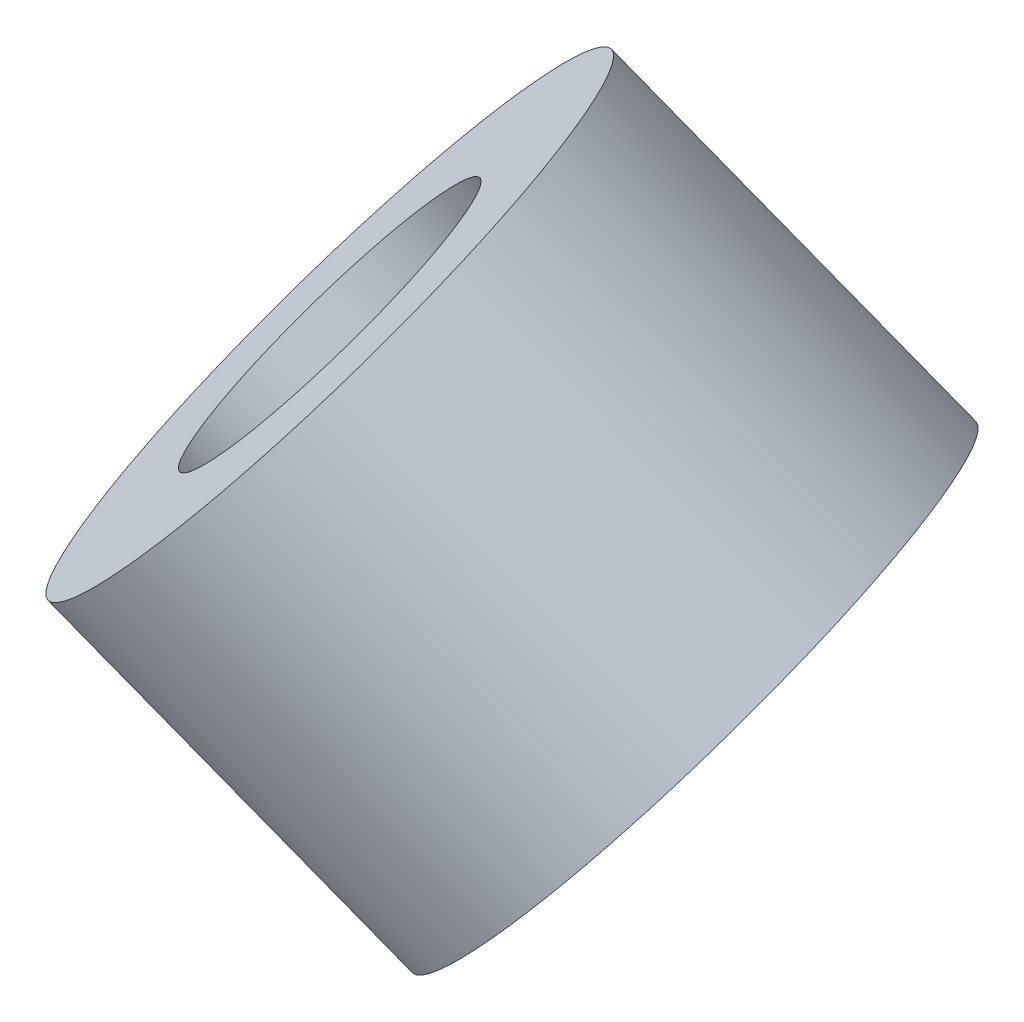
ISO-10303-21;
HEADER;
FILE_DESCRIPTION(('STEP AP214'),'2;1');
FILE_NAME('part.step','',(''),(''),'','','');
FILE_SCHEMA(('AUTOMOTIVE_DESIGN { 1 0 10303 214 1 1 1 1 }'));
ENDSEC;
DATA;
#1=APPLICATION_CONTEXT('core data for automotive mechanical design processes');
#2=APPLICATION_PROTOCOL_DEFINITION('international standard','automotive_design',2000,#1);
#3=PRODUCT_CONTEXT('',#1,'mechanical');
#4=PRODUCT('Part','Part','',(#3));
#5=PRODUCT_RELATED_PRODUCT_CATEGORY('part','',(#4));
#6=PRODUCT_DEFINITION_FORMATION('','',#4);
#7=PRODUCT_DEFINITION_CONTEXT('part definition',#1,'design');
#8=PRODUCT_DEFINITION('design','',#6,#7);
#9=PRODUCT_DEFINITION_SHAPE('','',#8);
#10=(LENGTH_UNIT() NAMED_UNIT(*) SI_UNIT(.MILLI.,.METRE.));
#11=(NAMED_UNIT(*) PLANE_ANGLE_UNIT() SI_UNIT($,.RADIAN.));
#12=(NAMED_UNIT(*) SI_UNIT($,.STERADIAN.) SOLID_ANGLE_UNIT());
#13=UNCERTAINTY_MEASURE_WITH_UNIT(LENGTH_MEASURE(1.E-05),#10,'distance_accuracy_value','');
#14=(GEOMETRIC_REPRESENTATION_CONTEXT(3) GLOBAL_UNCERTAINTY_ASSIGNED_CONTEXT((#13)) GLOBAL_UNIT_ASSIGNED_CONTEXT((#10,
#11,#12)) REPRESENTATION_CONTEXT('',''));
#15=CARTESIAN_POINT('',(0.,0.,0.));
#16=DIRECTION('',(0.,0.,1.));
#17=DIRECTION('',(1.,0.,0.));
#18=AXIS2_PLACEMENT_3D('',#15,#16,#17);
#19=CARTESIAN_POINT('',(221.813090671811,-117.528711420411,-96.7770600447819));
#20=DIRECTION('',(-0.705539430285629,0.652935143021137,0.275481054376154));
#21=DIRECTION('',(-0.679216402268474,-0.733938062025312,0.));
#22=AXIS2_PLACEMENT_3D('',#19,#20,#21);
#23=CYLINDRICAL_SURFACE('',#22,3.74999999999893);
#24=CARTESIAN_POINT('',(221.813090671811,-117.528711420411,-96.7770600447819));
#25=DIRECTION('',(-0.705539430285629,0.652935143021137,0.275481054376154));
#26=DIRECTION('',(-0.679216402268474,-0.733938062025312,0.));
#27=AXIS2_PLACEMENT_3D('',#24,#25,#26);
#28=CIRCLE('',#27,3.74999999999893);
#29=CARTESIAN_POINT('',(219.266029163305,-120.280979153005,-96.7770600447819));
#30=VERTEX_POINT('',#29);
#31=EDGE_CURVE('E10',#30,#30,#28,.T.);
#32=ORIENTED_EDGE('',*,*,#31,.T.);
#33=EDGE_LOOP('',(#32));
#34=FACE_BOUND('',#33,.T.);
#35=CARTESIAN_POINT('',(218.285393520383,-114.264035705305,-95.3996547729012));
#36=DIRECTION('',(-0.705539430285629,0.652935143021137,0.275481054376154));
#37=DIRECTION('',(-0.679216402268474,-0.733938062025312,0.));
#38=AXIS2_PLACEMENT_3D('',#35,#36,#37);
#39=CIRCLE('',#38,3.74999999999893);
#40=CARTESIAN_POINT('',(215.738332011877,-117.016303437899,-95.3996547729012));
#41=VERTEX_POINT('',#40);
#42=EDGE_CURVE('E34',#41,#41,#39,.T.);
#43=ORIENTED_EDGE('',*,*,#42,.F.);
#44=EDGE_LOOP('',(#43));
#45=FACE_BOUND('',#44,.T.);
#46=ADVANCED_FACE('F31',(#34,#45),#23,.T.);
#47=CARTESIAN_POINT('',(221.813090671811,-117.528711420411,-96.7770600447819));
#48=DIRECTION('',(-0.705539430285629,0.652935143021137,0.275481054376154));
#49=DIRECTION('',(-0.679216402268474,-0.733938062025312,0.));
#50=AXIS2_PLACEMENT_3D('',#47,#48,#49);
#51=PLANE('',#50);
#52=CARTESIAN_POINT('',(221.813090671811,-117.528711420411,-96.7770600447819));
#53=DIRECTION('',(-0.705539430285629,0.652935143021137,0.275481054376154));
#54=DIRECTION('',(-0.679216402268474,-0.733938062025312,0.));
#55=AXIS2_PLACEMENT_3D('',#52,#53,#54);
#56=CIRCLE('',#55,1.99999999999893);
#57=CARTESIAN_POINT('',(220.454657867275,-118.996587544461,-96.7770600447819));
#58=VERTEX_POINT('',#57);
#59=EDGE_CURVE('E41',#58,#58,#56,.T.);
#60=ORIENTED_EDGE('',*,*,#59,.T.);
#61=EDGE_LOOP('',(#60));
#62=FACE_BOUND('',#61,.T.);
#63=ORIENTED_EDGE('',*,*,#31,.F.);
#64=EDGE_LOOP('',(#63));
#65=FACE_BOUND('',#64,.T.);
#66=ADVANCED_FACE('F49',(#62,#65),#51,.F.);
#67=CARTESIAN_POINT('',(218.285393520383,-114.264035705305,-95.3996547729012));
#68=DIRECTION('',(-0.705539430285629,0.652935143021137,0.275481054376154));
#69=DIRECTION('',(-0.679216402268474,-0.733938062025312,0.));
#70=AXIS2_PLACEMENT_3D('',#67,#68,#69);
#71=PLANE('',#70);
#72=CARTESIAN_POINT('',(218.285393520383,-114.264035705305,-95.3996547729012));
#73=DIRECTION('',(-0.705539430285629,0.652935143021137,0.275481054376154));
#74=DIRECTION('',(-0.679216402268474,-0.733938062025312,0.));
#75=AXIS2_PLACEMENT_3D('',#72,#73,#74);
#76=CIRCLE('',#75,1.99999999999893);
#77=CARTESIAN_POINT('',(216.926960715847,-115.731911829355,-95.3996547729012));
#78=VERTEX_POINT('',#77);
#79=EDGE_CURVE('E43',#78,#78,#76,.T.);
#80=ORIENTED_EDGE('',*,*,#79,.F.);
#81=EDGE_LOOP('',(#80));
#82=FACE_BOUND('',#81,.T.);
#83=ORIENTED_EDGE('',*,*,#42,.T.);
#84=EDGE_LOOP('',(#83));
#85=FACE_BOUND('',#84,.T.);
#86=ADVANCED_FACE('F55',(#82,#85),#71,.T.);
#87=CARTESIAN_POINT('',(221.813090671811,-117.528711420411,-96.7770600447819));
#88=DIRECTION('',(-0.705539430285629,0.652935143021137,0.275481054376154));
#89=DIRECTION('',(-0.679216402268474,-0.733938062025312,0.));
#90=AXIS2_PLACEMENT_3D('',#87,#88,#89);
#91=CYLINDRICAL_SURFACE('',#90,1.99999999999893);
#92=ORIENTED_EDGE('',*,*,#59,.F.);
#93=EDGE_LOOP('',(#92));
#94=FACE_BOUND('',#93,.T.);
#95=ORIENTED_EDGE('',*,*,#79,.T.);
#96=EDGE_LOOP('',(#95));
#97=FACE_BOUND('',#96,.T.);
#98=ADVANCED_FACE('F52',(#94,#97),#91,.F.);
#99=CLOSED_SHELL('',(#46,#66,#86,#98));
#100=MANIFOLD_SOLID_BREP('B2',#99);
#101=ADVANCED_BREP_SHAPE_REPRESENTATION('',(#18,#100),#14);
#102=SHAPE_DEFINITION_REPRESENTATION(#9,#101);
ENDSEC;
END-ISO-10303-21;
